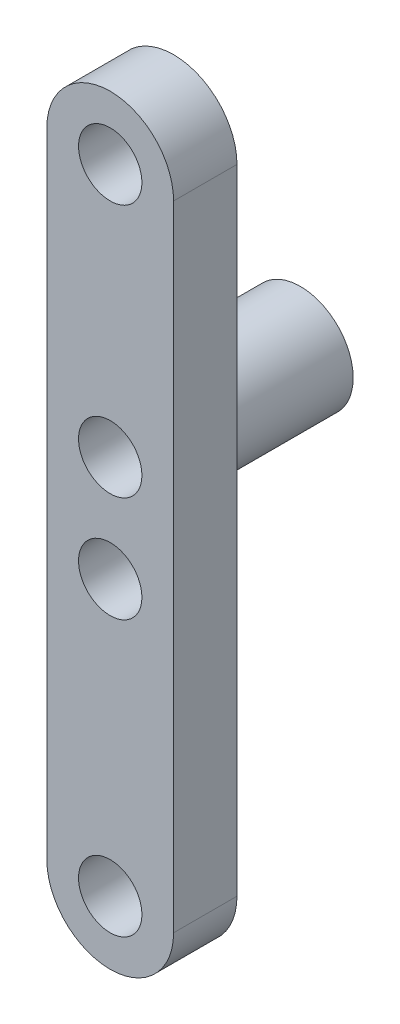
ISO-10303-21;
HEADER;
FILE_DESCRIPTION(('STEP AP214'),'2;1');
FILE_NAME('part.step','',(''),(''),'','','');
FILE_SCHEMA(('AUTOMOTIVE_DESIGN { 1 0 10303 214 1 1 1 1 }'));
ENDSEC;
DATA;
#1=APPLICATION_CONTEXT('core data for automotive mechanical design processes');
#2=APPLICATION_PROTOCOL_DEFINITION('international standard','automotive_design',2000,#1);
#3=PRODUCT_CONTEXT('',#1,'mechanical');
#4=PRODUCT('Part','Part','',(#3));
#5=PRODUCT_RELATED_PRODUCT_CATEGORY('part','',(#4));
#6=PRODUCT_DEFINITION_FORMATION('','',#4);
#7=PRODUCT_DEFINITION_CONTEXT('part definition',#1,'design');
#8=PRODUCT_DEFINITION('design','',#6,#7);
#9=PRODUCT_DEFINITION_SHAPE('','',#8);
#10=(LENGTH_UNIT() NAMED_UNIT(*) SI_UNIT(.MILLI.,.METRE.));
#11=(NAMED_UNIT(*) PLANE_ANGLE_UNIT() SI_UNIT($,.RADIAN.));
#12=(NAMED_UNIT(*) SI_UNIT($,.STERADIAN.) SOLID_ANGLE_UNIT());
#13=UNCERTAINTY_MEASURE_WITH_UNIT(LENGTH_MEASURE(1.E-05),#10,'distance_accuracy_value','');
#14=(GEOMETRIC_REPRESENTATION_CONTEXT(3) GLOBAL_UNCERTAINTY_ASSIGNED_CONTEXT((#13)) GLOBAL_UNIT_ASSIGNED_CONTEXT((#10,
#11,#12)) REPRESENTATION_CONTEXT('',''));
#15=CARTESIAN_POINT('',(0.,0.,0.));
#16=DIRECTION('',(0.,0.,1.));
#17=DIRECTION('',(1.,0.,0.));
#18=AXIS2_PLACEMENT_3D('',#15,#16,#17);
#19=CARTESIAN_POINT('',(0.,-12.,-6.));
#20=DIRECTION('',(0.,0.,1.));
#21=DIRECTION('',(1.,0.,0.));
#22=AXIS2_PLACEMENT_3D('',#19,#20,#21);
#23=CYLINDRICAL_SURFACE('',#22,2.5);
#24=CARTESIAN_POINT('',(0.,-12.,-6.));
#25=DIRECTION('',(0.,0.,1.));
#26=DIRECTION('',(1.,0.,0.));
#27=AXIS2_PLACEMENT_3D('',#24,#25,#26);
#28=CIRCLE('',#27,2.5);
#29=CARTESIAN_POINT('',(2.5,-12.,-6.));
#30=VERTEX_POINT('',#29);
#31=EDGE_CURVE('E11',#30,#30,#28,.T.);
#32=ORIENTED_EDGE('',*,*,#31,.T.);
#33=EDGE_LOOP('',(#32));
#34=FACE_BOUND('',#33,.T.);
#35=CARTESIAN_POINT('',(0.,-12.,0.));
#36=DIRECTION('',(0.,0.,1.));
#37=DIRECTION('',(1.,0.,0.));
#38=AXIS2_PLACEMENT_3D('',#35,#36,#37);
#39=CIRCLE('',#38,2.5);
#40=CARTESIAN_POINT('',(2.5,-12.,0.));
#41=VERTEX_POINT('',#40);
#42=EDGE_CURVE('E48',#41,#41,#39,.T.);
#43=ORIENTED_EDGE('',*,*,#42,.F.);
#44=EDGE_LOOP('',(#43));
#45=FACE_BOUND('',#44,.T.);
#46=ADVANCED_FACE('F45',(#34,#45),#23,.T.);
#47=CARTESIAN_POINT('',(0.,-12.,-6.));
#48=DIRECTION('',(0.,0.,1.));
#49=DIRECTION('',(1.,0.,0.));
#50=AXIS2_PLACEMENT_3D('',#47,#48,#49);
#51=PLANE('',#50);
#52=CARTESIAN_POINT('',(0.,-12.,-6.));
#53=DIRECTION('',(0.,0.,1.));
#54=DIRECTION('',(1.,0.,0.));
#55=AXIS2_PLACEMENT_3D('',#52,#53,#54);
#56=CIRCLE('',#55,1.5);
#57=CARTESIAN_POINT('',(1.5,-12.,-6.));
#58=VERTEX_POINT('',#57);
#59=EDGE_CURVE('E55',#58,#58,#56,.T.);
#60=ORIENTED_EDGE('',*,*,#59,.T.);
#61=EDGE_LOOP('',(#60));
#62=FACE_BOUND('',#61,.T.);
#63=ORIENTED_EDGE('',*,*,#31,.F.);
#64=EDGE_LOOP('',(#63));
#65=FACE_BOUND('',#64,.T.);
#66=ADVANCED_FACE('F63',(#62,#65),#51,.F.);
#67=CARTESIAN_POINT('',(0.,-12.,0.));
#68=DIRECTION('',(0.,0.,1.));
#69=DIRECTION('',(1.,0.,0.));
#70=AXIS2_PLACEMENT_3D('',#67,#68,#69);
#71=PLANE('',#70);
#72=CARTESIAN_POINT('',(0.,-12.,0.));
#73=DIRECTION('',(0.,0.,1.));
#74=DIRECTION('',(1.,0.,0.));
#75=AXIS2_PLACEMENT_3D('',#72,#73,#74);
#76=CIRCLE('',#75,1.5);
#77=CARTESIAN_POINT('',(1.5,-12.,0.));
#78=VERTEX_POINT('',#77);
#79=EDGE_CURVE('E57',#78,#78,#76,.T.);
#80=ORIENTED_EDGE('',*,*,#79,.F.);
#81=EDGE_LOOP('',(#80));
#82=FACE_BOUND('',#81,.T.);
#83=ORIENTED_EDGE('',*,*,#42,.T.);
#84=EDGE_LOOP('',(#83));
#85=FACE_BOUND('',#84,.T.);
#86=ADVANCED_FACE('F69',(#82,#85),#71,.T.);
#87=CARTESIAN_POINT('',(0.,-12.,-6.));
#88=DIRECTION('',(0.,0.,1.));
#89=DIRECTION('',(1.,0.,0.));
#90=AXIS2_PLACEMENT_3D('',#87,#88,#89);
#91=CYLINDRICAL_SURFACE('',#90,1.5);
#92=ORIENTED_EDGE('',*,*,#59,.F.);
#93=EDGE_LOOP('',(#92));
#94=FACE_BOUND('',#93,.T.);
#95=ORIENTED_EDGE('',*,*,#79,.T.);
#96=EDGE_LOOP('',(#95));
#97=FACE_BOUND('',#96,.T.);
#98=ADVANCED_FACE('F66',(#94,#97),#91,.F.);
#99=CLOSED_SHELL('',(#46,#66,#86,#98));
#100=MANIFOLD_SOLID_BREP('B2',#99);
#101=CARTESIAN_POINT('',(0.,0.,3.));
#102=DIRECTION('',(0.,0.,1.));
#103=DIRECTION('',(1.,0.,0.));
#104=AXIS2_PLACEMENT_3D('',#101,#102,#103);
#105=PLANE('',#104);
#106=CARTESIAN_POINT('',(0.,-17.,3.));
#107=DIRECTION('',(0.,0.,1.));
#108=DIRECTION('',(1.,0.,0.));
#109=AXIS2_PLACEMENT_3D('',#106,#107,#108);
#110=CIRCLE('',#109,1.5);
#111=CARTESIAN_POINT('',(1.5,-17.,3.));
#112=VERTEX_POINT('',#111);
#113=EDGE_CURVE('E197',#112,#112,#110,.T.);
#114=ORIENTED_EDGE('',*,*,#113,.F.);
#115=EDGE_LOOP('',(#114));
#116=FACE_BOUND('',#115,.T.);
#117=CARTESIAN_POINT('',(0.,0.,3.));
#118=DIRECTION('',(0.,0.,1.));
#119=DIRECTION('',(1.,0.,0.));
#120=AXIS2_PLACEMENT_3D('',#117,#118,#119);
#121=CIRCLE('',#120,1.5);
#122=CARTESIAN_POINT('',(1.5,0.,3.));
#123=VERTEX_POINT('',#122);
#124=EDGE_CURVE('E176',#123,#123,#121,.T.);
#125=ORIENTED_EDGE('',*,*,#124,.F.);
#126=EDGE_LOOP('',(#125));
#127=FACE_BOUND('',#126,.T.);
#128=CARTESIAN_POINT('',(0.,0.,3.));
#129=DIRECTION('',(0.,0.,1.));
#130=DIRECTION('',(1.,0.,0.));
#131=AXIS2_PLACEMENT_3D('',#128,#129,#130);
#132=CIRCLE('',#131,3.);
#133=CARTESIAN_POINT('',(3.,0.,3.));
#134=VERTEX_POINT('',#133);
#135=CARTESIAN_POINT('',(-3.,0.,3.));
#136=VERTEX_POINT('',#135);
#137=EDGE_CURVE('E161',#134,#136,#132,.T.);
#138=ORIENTED_EDGE('',*,*,#137,.T.);
#139=DIRECTION('',(0.,-1.,0.));
#140=VECTOR('',#139,1.);
#141=CARTESIAN_POINT('',(-3.,0.,3.));
#142=LINE('',#141,#140);
#143=CARTESIAN_POINT('',(-3.,-30.,3.));
#144=VERTEX_POINT('',#143);
#145=EDGE_CURVE('E156',#136,#144,#142,.T.);
#146=ORIENTED_EDGE('',*,*,#145,.T.);
#147=CARTESIAN_POINT('',(0.,-30.,3.));
#148=DIRECTION('',(0.,0.,1.));
#149=DIRECTION('',(-1.,0.,0.));
#150=AXIS2_PLACEMENT_3D('',#147,#148,#149);
#151=CIRCLE('',#150,3.);
#152=CARTESIAN_POINT('',(3.,-30.,3.));
#153=VERTEX_POINT('',#152);
#154=EDGE_CURVE('E159',#144,#153,#151,.T.);
#155=ORIENTED_EDGE('',*,*,#154,.T.);
#156=DIRECTION('',(0.,1.,0.));
#157=VECTOR('',#156,1.);
#158=CARTESIAN_POINT('',(3.,0.,3.));
#159=LINE('',#158,#157);
#160=EDGE_CURVE('E126',#153,#134,#159,.T.);
#161=ORIENTED_EDGE('',*,*,#160,.T.);
#162=EDGE_LOOP('',(#138,#146,#155,#161));
#163=FACE_BOUND('',#162,.T.);
#164=CARTESIAN_POINT('',(0.,-30.,3.));
#165=DIRECTION('',(0.,0.,1.));
#166=DIRECTION('',(-1.,0.,0.));
#167=AXIS2_PLACEMENT_3D('',#164,#165,#166);
#168=CIRCLE('',#167,1.5);
#169=CARTESIAN_POINT('',(-1.5,-30.,3.));
#170=VERTEX_POINT('',#169);
#171=EDGE_CURVE('E191',#170,#170,#168,.T.);
#172=ORIENTED_EDGE('',*,*,#171,.F.);
#173=EDGE_LOOP('',(#172));
#174=FACE_BOUND('',#173,.T.);
#175=CARTESIAN_POINT('',(0.,-12.,3.));
#176=DIRECTION('',(0.,0.,1.));
#177=DIRECTION('',(1.,0.,0.));
#178=AXIS2_PLACEMENT_3D('',#175,#176,#177);
#179=CIRCLE('',#178,1.5);
#180=CARTESIAN_POINT('',(1.5,-12.,3.));
#181=VERTEX_POINT('',#180);
#182=EDGE_CURVE('E203',#181,#181,#179,.T.);
#183=ORIENTED_EDGE('',*,*,#182,.F.);
#184=EDGE_LOOP('',(#183));
#185=FACE_BOUND('',#184,.T.);
#186=ADVANCED_FACE('F109',(#116,#127,#163,#174,#185),#105,.T.);
#187=CARTESIAN_POINT('',(0.,0.,0.));
#188=DIRECTION('',(0.,0.,1.));
#189=DIRECTION('',(1.,0.,0.));
#190=AXIS2_PLACEMENT_3D('',#187,#188,#189);
#191=PLANE('',#190);
#192=CARTESIAN_POINT('',(0.,0.,0.));
#193=DIRECTION('',(0.,0.,1.));
#194=DIRECTION('',(1.,0.,0.));
#195=AXIS2_PLACEMENT_3D('',#192,#193,#194);
#196=CIRCLE('',#195,3.);
#197=CARTESIAN_POINT('',(3.,0.,0.));
#198=VERTEX_POINT('',#197);
#199=CARTESIAN_POINT('',(-3.,0.,0.));
#200=VERTEX_POINT('',#199);
#201=EDGE_CURVE('E173',#198,#200,#196,.T.);
#202=ORIENTED_EDGE('',*,*,#201,.F.);
#203=DIRECTION('',(0.,1.,0.));
#204=VECTOR('',#203,1.);
#205=CARTESIAN_POINT('',(3.,0.,0.));
#206=LINE('',#205,#204);
#207=CARTESIAN_POINT('',(3.,-30.,0.));
#208=VERTEX_POINT('',#207);
#209=EDGE_CURVE('E149',#208,#198,#206,.T.);
#210=ORIENTED_EDGE('',*,*,#209,.F.);
#211=CARTESIAN_POINT('',(0.,-30.,0.));
#212=DIRECTION('',(0.,0.,1.));
#213=DIRECTION('',(-1.,0.,0.));
#214=AXIS2_PLACEMENT_3D('',#211,#212,#213);
#215=CIRCLE('',#214,3.);
#216=CARTESIAN_POINT('',(-3.,-30.,0.));
#217=VERTEX_POINT('',#216);
#218=EDGE_CURVE('E143',#217,#208,#215,.T.);
#219=ORIENTED_EDGE('',*,*,#218,.F.);
#220=DIRECTION('',(0.,-1.,0.));
#221=VECTOR('',#220,1.);
#222=CARTESIAN_POINT('',(-3.,0.,0.));
#223=LINE('',#222,#221);
#224=EDGE_CURVE('E165',#200,#217,#223,.T.);
#225=ORIENTED_EDGE('',*,*,#224,.F.);
#226=EDGE_LOOP('',(#202,#210,#219,#225));
#227=FACE_BOUND('',#226,.T.);
#228=CARTESIAN_POINT('',(0.,0.,0.));
#229=DIRECTION('',(0.,0.,1.));
#230=DIRECTION('',(1.,0.,0.));
#231=AXIS2_PLACEMENT_3D('',#228,#229,#230);
#232=CIRCLE('',#231,1.5);
#233=CARTESIAN_POINT('',(1.5,0.,0.));
#234=VERTEX_POINT('',#233);
#235=EDGE_CURVE('E188',#234,#234,#232,.T.);
#236=ORIENTED_EDGE('',*,*,#235,.T.);
#237=EDGE_LOOP('',(#236));
#238=FACE_BOUND('',#237,.T.);
#239=CARTESIAN_POINT('',(0.,-30.,0.));
#240=DIRECTION('',(0.,0.,1.));
#241=DIRECTION('',(-1.,0.,0.));
#242=AXIS2_PLACEMENT_3D('',#239,#240,#241);
#243=CIRCLE('',#242,1.5);
#244=CARTESIAN_POINT('',(-1.5,-30.,0.));
#245=VERTEX_POINT('',#244);
#246=EDGE_CURVE('E194',#245,#245,#243,.T.);
#247=ORIENTED_EDGE('',*,*,#246,.T.);
#248=EDGE_LOOP('',(#247));
#249=FACE_BOUND('',#248,.T.);
#250=CARTESIAN_POINT('',(0.,-17.,0.));
#251=DIRECTION('',(0.,0.,1.));
#252=DIRECTION('',(1.,0.,0.));
#253=AXIS2_PLACEMENT_3D('',#250,#251,#252);
#254=CIRCLE('',#253,1.5);
#255=CARTESIAN_POINT('',(1.5,-17.,0.));
#256=VERTEX_POINT('',#255);
#257=EDGE_CURVE('E200',#256,#256,#254,.T.);
#258=ORIENTED_EDGE('',*,*,#257,.T.);
#259=EDGE_LOOP('',(#258));
#260=FACE_BOUND('',#259,.T.);
#261=CARTESIAN_POINT('',(0.,-12.,0.));
#262=DIRECTION('',(0.,0.,1.));
#263=DIRECTION('',(1.,0.,0.));
#264=AXIS2_PLACEMENT_3D('',#261,#262,#263);
#265=CIRCLE('',#264,1.5);
#266=CARTESIAN_POINT('',(1.5,-12.,0.));
#267=VERTEX_POINT('',#266);
#268=EDGE_CURVE('E206',#267,#267,#265,.T.);
#269=ORIENTED_EDGE('',*,*,#268,.T.);
#270=EDGE_LOOP('',(#269));
#271=FACE_BOUND('',#270,.T.);
#272=ADVANCED_FACE('F184',(#227,#238,#249,#260,#271),#191,.F.);
#273=CARTESIAN_POINT('',(0.,0.,3.));
#274=DIRECTION('',(0.,0.,-1.));
#275=DIRECTION('',(-1.,0.,0.));
#276=AXIS2_PLACEMENT_3D('',#273,#274,#275);
#277=CYLINDRICAL_SURFACE('',#276,3.);
#278=ORIENTED_EDGE('',*,*,#201,.T.);
#279=DIRECTION('',(0.,0.,-1.));
#280=VECTOR('',#279,1.);
#281=CARTESIAN_POINT('',(-3.,0.,3.));
#282=LINE('',#281,#280);
#283=EDGE_CURVE('E43',#136,#200,#282,.T.);
#284=ORIENTED_EDGE('',*,*,#283,.F.);
#285=ORIENTED_EDGE('',*,*,#137,.F.);
#286=DIRECTION('',(0.,0.,-1.));
#287=VECTOR('',#286,1.);
#288=CARTESIAN_POINT('',(3.,0.,3.));
#289=LINE('',#288,#287);
#290=EDGE_CURVE('E169',#134,#198,#289,.T.);
#291=ORIENTED_EDGE('',*,*,#290,.T.);
#292=EDGE_LOOP('',(#278,#284,#285,#291));
#293=FACE_BOUND('',#292,.T.);
#294=ADVANCED_FACE('F111',(#293),#277,.T.);
#295=CARTESIAN_POINT('',(-3.,0.,3.));
#296=DIRECTION('',(1.,0.,0.));
#297=DIRECTION('',(0.,1.,0.));
#298=AXIS2_PLACEMENT_3D('',#295,#296,#297);
#299=PLANE('',#298);
#300=ORIENTED_EDGE('',*,*,#224,.T.);
#301=DIRECTION('',(0.,0.,-1.));
#302=VECTOR('',#301,1.);
#303=CARTESIAN_POINT('',(-3.,-30.,3.));
#304=LINE('',#303,#302);
#305=EDGE_CURVE('E118',#144,#217,#304,.T.);
#306=ORIENTED_EDGE('',*,*,#305,.F.);
#307=ORIENTED_EDGE('',*,*,#145,.F.);
#308=ORIENTED_EDGE('',*,*,#283,.T.);
#309=EDGE_LOOP('',(#300,#306,#307,#308));
#310=FACE_BOUND('',#309,.T.);
#311=ADVANCED_FACE('F164',(#310),#299,.F.);
#312=CARTESIAN_POINT('',(0.,-30.,3.));
#313=DIRECTION('',(0.,0.,-1.));
#314=DIRECTION('',(-1.,0.,0.));
#315=AXIS2_PLACEMENT_3D('',#312,#313,#314);
#316=CYLINDRICAL_SURFACE('',#315,3.);
#317=ORIENTED_EDGE('',*,*,#218,.T.);
#318=DIRECTION('',(0.,0.,-1.));
#319=VECTOR('',#318,1.);
#320=CARTESIAN_POINT('',(3.,-30.,3.));
#321=LINE('',#320,#319);
#322=EDGE_CURVE('E166',#153,#208,#321,.T.);
#323=ORIENTED_EDGE('',*,*,#322,.F.);
#324=ORIENTED_EDGE('',*,*,#154,.F.);
#325=ORIENTED_EDGE('',*,*,#305,.T.);
#326=EDGE_LOOP('',(#317,#323,#324,#325));
#327=FACE_BOUND('',#326,.T.);
#328=ADVANCED_FACE('F167',(#327),#316,.T.);
#329=CARTESIAN_POINT('',(3.,0.,3.));
#330=DIRECTION('',(-1.,0.,0.));
#331=DIRECTION('',(0.,-1.,0.));
#332=AXIS2_PLACEMENT_3D('',#329,#330,#331);
#333=PLANE('',#332);
#334=ORIENTED_EDGE('',*,*,#209,.T.);
#335=ORIENTED_EDGE('',*,*,#290,.F.);
#336=ORIENTED_EDGE('',*,*,#160,.F.);
#337=ORIENTED_EDGE('',*,*,#322,.T.);
#338=EDGE_LOOP('',(#334,#335,#336,#337));
#339=FACE_BOUND('',#338,.T.);
#340=ADVANCED_FACE('F181',(#339),#333,.F.);
#341=CARTESIAN_POINT('',(0.,0.,3.));
#342=DIRECTION('',(0.,0.,-1.));
#343=DIRECTION('',(-1.,0.,0.));
#344=AXIS2_PLACEMENT_3D('',#341,#342,#343);
#345=CYLINDRICAL_SURFACE('',#344,1.5);
#346=ORIENTED_EDGE('',*,*,#124,.T.);
#347=EDGE_LOOP('',(#346));
#348=FACE_BOUND('',#347,.T.);
#349=ORIENTED_EDGE('',*,*,#235,.F.);
#350=EDGE_LOOP('',(#349));
#351=FACE_BOUND('',#350,.T.);
#352=ADVANCED_FACE('F225',(#348,#351),#345,.F.);
#353=CARTESIAN_POINT('',(0.,-30.,3.));
#354=DIRECTION('',(0.,0.,-1.));
#355=DIRECTION('',(-1.,0.,0.));
#356=AXIS2_PLACEMENT_3D('',#353,#354,#355);
#357=CYLINDRICAL_SURFACE('',#356,1.5);
#358=ORIENTED_EDGE('',*,*,#171,.T.);
#359=EDGE_LOOP('',(#358));
#360=FACE_BOUND('',#359,.T.);
#361=ORIENTED_EDGE('',*,*,#246,.F.);
#362=EDGE_LOOP('',(#361));
#363=FACE_BOUND('',#362,.T.);
#364=ADVANCED_FACE('F271',(#360,#363),#357,.F.);
#365=CARTESIAN_POINT('',(0.,-17.,3.));
#366=DIRECTION('',(0.,0.,-1.));
#367=DIRECTION('',(-1.,0.,0.));
#368=AXIS2_PLACEMENT_3D('',#365,#366,#367);
#369=CYLINDRICAL_SURFACE('',#368,1.5);
#370=ORIENTED_EDGE('',*,*,#113,.T.);
#371=EDGE_LOOP('',(#370));
#372=FACE_BOUND('',#371,.T.);
#373=ORIENTED_EDGE('',*,*,#257,.F.);
#374=EDGE_LOOP('',(#373));
#375=FACE_BOUND('',#374,.T.);
#376=ADVANCED_FACE('F279',(#372,#375),#369,.F.);
#377=CARTESIAN_POINT('',(0.,-12.,3.));
#378=DIRECTION('',(0.,0.,-1.));
#379=DIRECTION('',(-1.,0.,0.));
#380=AXIS2_PLACEMENT_3D('',#377,#378,#379);
#381=CYLINDRICAL_SURFACE('',#380,1.5);
#382=ORIENTED_EDGE('',*,*,#182,.T.);
#383=EDGE_LOOP('',(#382));
#384=FACE_BOUND('',#383,.T.);
#385=ORIENTED_EDGE('',*,*,#268,.F.);
#386=EDGE_LOOP('',(#385));
#387=FACE_BOUND('',#386,.T.);
#388=ADVANCED_FACE('F212',(#384,#387),#381,.F.);
#389=CLOSED_SHELL('',(#186,#272,#294,#311,#328,#340,#352,#364,#376,#388));
#390=MANIFOLD_SOLID_BREP('B6',#389);
#391=ADVANCED_BREP_SHAPE_REPRESENTATION('',(#18,#100,#390),#14);
#392=SHAPE_DEFINITION_REPRESENTATION(#9,#391);
ENDSEC;
END-ISO-10303-21;
